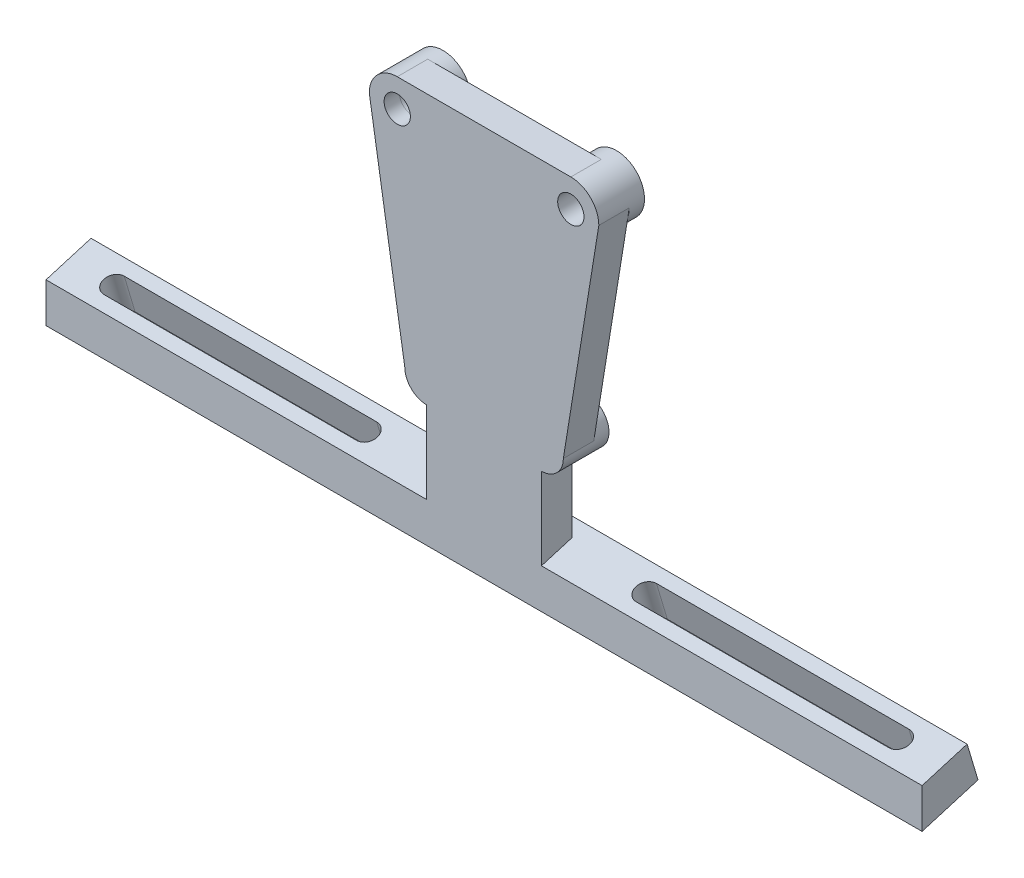
ISO-10303-21;
HEADER;
FILE_DESCRIPTION(('STEP AP214'),'2;1');
FILE_NAME('part.step','',(''),(''),'','','');
FILE_SCHEMA(('AUTOMOTIVE_DESIGN { 1 0 10303 214 1 1 1 1 }'));
ENDSEC;
DATA;
#1=APPLICATION_CONTEXT('core data for automotive mechanical design processes');
#2=APPLICATION_PROTOCOL_DEFINITION('international standard','automotive_design',2000,#1);
#3=PRODUCT_CONTEXT('',#1,'mechanical');
#4=PRODUCT('Part','Part','',(#3));
#5=PRODUCT_RELATED_PRODUCT_CATEGORY('part','',(#4));
#6=PRODUCT_DEFINITION_FORMATION('','',#4);
#7=PRODUCT_DEFINITION_CONTEXT('part definition',#1,'design');
#8=PRODUCT_DEFINITION('design','',#6,#7);
#9=PRODUCT_DEFINITION_SHAPE('','',#8);
#10=(LENGTH_UNIT() NAMED_UNIT(*) SI_UNIT(.MILLI.,.METRE.));
#11=(NAMED_UNIT(*) PLANE_ANGLE_UNIT() SI_UNIT($,.RADIAN.));
#12=(NAMED_UNIT(*) SI_UNIT($,.STERADIAN.) SOLID_ANGLE_UNIT());
#13=UNCERTAINTY_MEASURE_WITH_UNIT(LENGTH_MEASURE(1.E-05),#10,'distance_accuracy_value','');
#14=(GEOMETRIC_REPRESENTATION_CONTEXT(3) GLOBAL_UNCERTAINTY_ASSIGNED_CONTEXT((#13)) GLOBAL_UNIT_ASSIGNED_CONTEXT((#10,
#11,#12)) REPRESENTATION_CONTEXT('',''));
#15=CARTESIAN_POINT('',(0.,0.,0.));
#16=DIRECTION('',(0.,0.,1.));
#17=DIRECTION('',(1.,0.,0.));
#18=AXIS2_PLACEMENT_3D('',#15,#16,#17);
#19=CARTESIAN_POINT('',(0.,-15.7739928273081,-4.7016006462552));
#20=DIRECTION('',(0.,-0.958336393200723,-0.285642009282651));
#21=DIRECTION('',(0.,0.285642009282651,-0.958336393200723));
#22=AXIS2_PLACEMENT_3D('',#19,#20,#21);
#23=PLANE('',#22);
#24=DIRECTION('',(1.,0.,0.));
#25=VECTOR('',#24,1.);
#26=CARTESIAN_POINT('',(0.,-17.2862308384462,0.371997333589113));
#27=LINE('',#26,#25);
#28=CARTESIAN_POINT('',(5.54960519700685,-17.2862308384462,0.37199733358911));
#29=VERTEX_POINT('',#28);
#30=CARTESIAN_POINT('',(47.6779734114226,-17.2862308384462,0.371997333589114));
#31=VERTEX_POINT('',#30);
#32=EDGE_CURVE('E283',#29,#31,#27,.T.);
#33=ORIENTED_EDGE('',*,*,#32,.F.);
#34=CARTESIAN_POINT('',(5.54960519700687,-17.7861043546908,2.04908602169037));
#35=DIRECTION('',(0.,-0.958336393200723,-0.285642009282651));
#36=DIRECTION('',(0.,0.285642009282651,-0.958336393200723));
#37=AXIS2_PLACEMENT_3D('',#34,#35,#36);
#38=CIRCLE('',#37,1.75);
#39=CARTESIAN_POINT('',(5.54960519700686,-18.2859778709354,3.72617470979162));
#40=VERTEX_POINT('',#39);
#41=EDGE_CURVE('E271',#29,#40,#38,.F.);
#42=ORIENTED_EDGE('',*,*,#41,.T.);
#43=DIRECTION('',(-1.,0.,0.));
#44=VECTOR('',#43,1.);
#45=CARTESIAN_POINT('',(0.,-18.2859778709354,3.72617470979162));
#46=LINE('',#45,#44);
#47=CARTESIAN_POINT('',(47.6779734114226,-18.2859778709354,3.72617470979162));
#48=VERTEX_POINT('',#47);
#49=EDGE_CURVE('E274',#48,#40,#46,.T.);
#50=ORIENTED_EDGE('',*,*,#49,.F.);
#51=CARTESIAN_POINT('',(47.6779734114226,-17.7861043546908,2.04908602169037));
#52=DIRECTION('',(0.,-0.958336393200723,-0.285642009282651));
#53=DIRECTION('',(0.,0.285642009282651,-0.958336393200723));
#54=AXIS2_PLACEMENT_3D('',#51,#52,#53);
#55=CIRCLE('',#54,1.75);
#56=EDGE_CURVE('E280',#48,#31,#55,.F.);
#57=ORIENTED_EDGE('',*,*,#56,.T.);
#58=EDGE_LOOP('',(#33,#42,#50,#57));
#59=FACE_BOUND('',#58,.T.);
#60=DIRECTION('',(0.,-0.285642009282651,0.958336393200723));
#61=VECTOR('',#60,1.);
#62=CARTESIAN_POINT('',(55.2979734114226,-15.7739928273081,-4.70160064625521));
#63=LINE('',#62,#61);
#64=CARTESIAN_POINT('',(55.2979734114226,-16.6662659033874,-1.70800119767469));
#65=VERTEX_POINT('',#64);
#66=CARTESIAN_POINT('',(55.2979734114226,-19.4465725092372,7.61999999981606));
#67=VERTEX_POINT('',#66);
#68=EDGE_CURVE('E307',#65,#67,#63,.T.);
#69=ORIENTED_EDGE('',*,*,#68,.T.);
#70=DIRECTION('',(-1.,0.,0.));
#71=VECTOR('',#70,1.);
#72=CARTESIAN_POINT('',(0.,-19.4465725092372,7.61999999981606));
#73=LINE('',#72,#71);
#74=CARTESIAN_POINT('',(-90.8579734114216,-19.4465725092372,7.61999999981606));
#75=VERTEX_POINT('',#74);
#76=EDGE_CURVE('E301',#67,#75,#73,.T.);
#77=ORIENTED_EDGE('',*,*,#76,.T.);
#78=DIRECTION('',(0.,-0.285642009282651,0.958336393200723));
#79=VECTOR('',#78,1.);
#80=CARTESIAN_POINT('',(-90.8579734114216,-15.7739928273081,-4.70160064625522));
#81=LINE('',#80,#79);
#82=CARTESIAN_POINT('',(-90.8579734114216,-16.6662659033874,-1.70800119767466));
#83=VERTEX_POINT('',#82);
#84=EDGE_CURVE('E306',#83,#75,#81,.T.);
#85=ORIENTED_EDGE('',*,*,#84,.F.);
#86=DIRECTION('',(-1.,0.,0.));
#87=VECTOR('',#86,1.);
#88=CARTESIAN_POINT('',(55.2979734114226,-16.6662659033874,-1.70800119767469));
#89=LINE('',#88,#87);
#90=EDGE_CURVE('E291',#65,#83,#89,.T.);
#91=ORIENTED_EDGE('',*,*,#90,.F.);
#92=EDGE_LOOP('',(#69,#77,#85,#91));
#93=FACE_BOUND('',#92,.T.);
#94=CARTESIAN_POINT('',(-83.2379734114216,-17.7861043546908,2.04908602169037));
#95=DIRECTION('',(0.,-0.958336393200723,-0.285642009282651));
#96=DIRECTION('',(0.,0.285642009282651,-0.958336393200723));
#97=AXIS2_PLACEMENT_3D('',#94,#95,#96);
#98=CIRCLE('',#97,1.75);
#99=CARTESIAN_POINT('',(-83.2379734114217,-18.2859778709355,3.72617470979163));
#100=VERTEX_POINT('',#99);
#101=CARTESIAN_POINT('',(-83.2379734114217,-17.2862308384462,0.371997333589108));
#102=VERTEX_POINT('',#101);
#103=EDGE_CURVE('E270',#100,#102,#98,.T.);
#104=ORIENTED_EDGE('',*,*,#103,.F.);
#105=DIRECTION('',(1.,0.,0.));
#106=VECTOR('',#105,1.);
#107=CARTESIAN_POINT('',(0.,-18.2859778709354,3.72617470979162));
#108=LINE('',#107,#106);
#109=CARTESIAN_POINT('',(-41.1096051970059,-18.2859778709355,3.72617470979162));
#110=VERTEX_POINT('',#109);
#111=EDGE_CURVE('E262',#100,#110,#108,.T.);
#112=ORIENTED_EDGE('',*,*,#111,.T.);
#113=CARTESIAN_POINT('',(-41.1096051970059,-17.7861043546908,2.04908602169037));
#114=DIRECTION('',(0.,-0.958336393200723,-0.285642009282651));
#115=DIRECTION('',(0.,0.285642009282651,-0.958336393200723));
#116=AXIS2_PLACEMENT_3D('',#113,#114,#115);
#117=CIRCLE('',#116,1.75);
#118=CARTESIAN_POINT('',(-41.1096051970059,-17.2862308384462,0.371997333589109));
#119=VERTEX_POINT('',#118);
#120=EDGE_CURVE('E248',#119,#110,#117,.T.);
#121=ORIENTED_EDGE('',*,*,#120,.F.);
#122=DIRECTION('',(-1.,0.,0.));
#123=VECTOR('',#122,1.);
#124=CARTESIAN_POINT('',(0.,-17.2862308384462,0.371997333589113));
#125=LINE('',#124,#123);
#126=EDGE_CURVE('E256',#119,#102,#125,.T.);
#127=ORIENTED_EDGE('',*,*,#126,.T.);
#128=EDGE_LOOP('',(#104,#112,#121,#127));
#129=FACE_BOUND('',#128,.T.);
#130=ADVANCED_FACE('F95',(#59,#93,#129),#23,.T.);
#131=CARTESIAN_POINT('',(55.4406036116355,-1.51179232123105,-30.3210318045859));
#132=DIRECTION('',(0.,0.958336393200728,0.285642009282632));
#133=DIRECTION('',(0.,-0.285642009282632,0.958336393200728));
#134=AXIS2_PLACEMENT_3D('',#131,#132,#133);
#135=PLANE('',#134);
#136=DIRECTION('',(-1.,0.,0.));
#137=VECTOR('',#136,1.);
#138=CARTESIAN_POINT('',(55.4406036116355,-11.2007947422388,2.18582409234985));
#139=LINE('',#138,#137);
#140=CARTESIAN_POINT('',(47.6779734114226,-11.2007947422388,2.18582409234984));
#141=VERTEX_POINT('',#140);
#142=CARTESIAN_POINT('',(5.54960519700685,-11.2007947422388,2.18582409234985));
#143=VERTEX_POINT('',#142);
#144=EDGE_CURVE('E12',#141,#143,#139,.T.);
#145=ORIENTED_EDGE('',*,*,#144,.F.);
#146=CARTESIAN_POINT('',(47.6779734114226,-11.7006682584834,3.86291278045111));
#147=DIRECTION('',(0.,0.958336393200728,0.285642009282632));
#148=DIRECTION('',(0.,-0.285642009282632,0.958336393200728));
#149=AXIS2_PLACEMENT_3D('',#146,#147,#148);
#150=CIRCLE('',#149,1.75);
#151=CARTESIAN_POINT('',(47.6779734114226,-12.200541774728,5.54000146855237));
#152=VERTEX_POINT('',#151);
#153=EDGE_CURVE('E103',#141,#152,#150,.F.);
#154=ORIENTED_EDGE('',*,*,#153,.T.);
#155=DIRECTION('',(1.,0.,0.));
#156=VECTOR('',#155,1.);
#157=CARTESIAN_POINT('',(55.4406036116355,-12.200541774728,5.54000146855236));
#158=LINE('',#157,#156);
#159=CARTESIAN_POINT('',(5.54960519700686,-12.200541774728,5.54000146855238));
#160=VERTEX_POINT('',#159);
#161=EDGE_CURVE('E453',#160,#152,#158,.T.);
#162=ORIENTED_EDGE('',*,*,#161,.F.);
#163=CARTESIAN_POINT('',(5.54960519700687,-11.7006682584834,3.86291278045112));
#164=DIRECTION('',(0.,0.958336393200728,0.285642009282632));
#165=DIRECTION('',(0.,-0.285642009282632,0.958336393200728));
#166=AXIS2_PLACEMENT_3D('',#163,#164,#165);
#167=CIRCLE('',#166,1.75);
#168=EDGE_CURVE('E450',#160,#143,#167,.F.);
#169=ORIENTED_EDGE('',*,*,#168,.T.);
#170=EDGE_LOOP('',(#145,#154,#162,#169));
#171=FACE_BOUND('',#170,.T.);
#172=DIRECTION('',(0.,0.285642009282632,-0.958336393200728));
#173=VECTOR('',#172,1.);
#174=CARTESIAN_POINT('',(-8.20202658857738,-13.0202651650178,8.29019482857502));
#175=LINE('',#174,#173);
#176=CARTESIAN_POINT('',(-8.20202658857735,-12.8205067097867,7.61999999981606));
#177=VERTEX_POINT('',#176);
#178=CARTESIAN_POINT('',(-8.20202658857738,-11.306360510758,2.53999999981602));
#179=VERTEX_POINT('',#178);
#180=EDGE_CURVE('E321',#177,#179,#175,.T.);
#181=ORIENTED_EDGE('',*,*,#180,.F.);
#182=DIRECTION('',(1.,0.,0.));
#183=VECTOR('',#182,1.);
#184=CARTESIAN_POINT('',(55.4406036116355,-12.8205067097867,7.61999999981606));
#185=LINE('',#184,#183);
#186=CARTESIAN_POINT('',(55.2979734114226,-12.8205067097867,7.61999999981607));
#187=VERTEX_POINT('',#186);
#188=EDGE_CURVE('E297',#177,#187,#185,.T.);
#189=ORIENTED_EDGE('',*,*,#188,.T.);
#190=DIRECTION('',(0.,-0.285642009282632,0.958336393200728));
#191=VECTOR('',#190,1.);
#192=CARTESIAN_POINT('',(55.2979734114226,-9.68855673110167,-2.88777388749156));
#193=LINE('',#192,#191);
#194=CARTESIAN_POINT('',(55.2979734114226,-10.58082980718,0.105825561086174));
#195=VERTEX_POINT('',#194);
#196=EDGE_CURVE('E311',#195,#187,#193,.T.);
#197=ORIENTED_EDGE('',*,*,#196,.F.);
#198=DIRECTION('',(1.,0.,0.));
#199=VECTOR('',#198,1.);
#200=CARTESIAN_POINT('',(-90.8579734114217,-10.58082980718,0.105825561086214));
#201=LINE('',#200,#199);
#202=CARTESIAN_POINT('',(-90.8579734114217,-10.58082980718,0.105825561086214));
#203=VERTEX_POINT('',#202);
#204=EDGE_CURVE('E285',#203,#195,#201,.T.);
#205=ORIENTED_EDGE('',*,*,#204,.F.);
#206=DIRECTION('',(0.,-0.285642009282632,0.958336393200728));
#207=VECTOR('',#206,1.);
#208=CARTESIAN_POINT('',(-90.8579734114216,-9.68855673110161,-2.88777388749153));
#209=LINE('',#208,#207);
#210=CARTESIAN_POINT('',(-90.8579734114217,-12.8205067097867,7.61999999981606));
#211=VERTEX_POINT('',#210);
#212=EDGE_CURVE('E310',#203,#211,#209,.T.);
#213=ORIENTED_EDGE('',*,*,#212,.T.);
#214=CARTESIAN_POINT('',(-27.3579734114216,-12.8205067097867,7.61999999981606));
#215=VERTEX_POINT('',#214);
#216=EDGE_CURVE('E300',#211,#215,#185,.T.);
#217=ORIENTED_EDGE('',*,*,#216,.T.);
#218=DIRECTION('',(0.,-0.285642009282632,0.958336393200728));
#219=VECTOR('',#218,1.);
#220=CARTESIAN_POINT('',(-27.3579734114216,-14.4108701202642,12.9557107326426));
#221=LINE('',#220,#219);
#222=CARTESIAN_POINT('',(-27.3579734114216,-11.306360510758,2.53999999981603));
#223=VERTEX_POINT('',#222);
#224=EDGE_CURVE('E318',#223,#215,#221,.T.);
#225=ORIENTED_EDGE('',*,*,#224,.F.);
#226=DIRECTION('',(-1.,0.,0.));
#227=VECTOR('',#226,1.);
#228=CARTESIAN_POINT('',(-27.3579734114216,-11.3063605101407,2.54));
#229=LINE('',#228,#227);
#230=EDGE_CURVE('E325',#179,#223,#229,.T.);
#231=ORIENTED_EDGE('',*,*,#230,.F.);
#232=EDGE_LOOP('',(#181,#189,#197,#205,#213,#217,#225,#231));
#233=FACE_BOUND('',#232,.T.);
#234=CARTESIAN_POINT('',(-41.1096051970059,-11.7006682584834,3.86291278045112));
#235=DIRECTION('',(0.,0.958336393200728,0.285642009282632));
#236=DIRECTION('',(0.,-0.285642009282632,0.958336393200728));
#237=AXIS2_PLACEMENT_3D('',#234,#235,#236);
#238=CIRCLE('',#237,1.75);
#239=CARTESIAN_POINT('',(-41.1096051970059,-12.200541774728,5.54000146855239));
#240=VERTEX_POINT('',#239);
#241=CARTESIAN_POINT('',(-41.1096051970059,-11.2007947422388,2.18582409234986));
#242=VERTEX_POINT('',#241);
#243=EDGE_CURVE('E442',#240,#242,#238,.T.);
#244=ORIENTED_EDGE('',*,*,#243,.F.);
#245=DIRECTION('',(-1.,0.,0.));
#246=VECTOR('',#245,1.);
#247=CARTESIAN_POINT('',(55.4406036116355,-12.200541774728,5.54000146855236));
#248=LINE('',#247,#246);
#249=CARTESIAN_POINT('',(-83.2379734114217,-12.200541774728,5.5400014685524));
#250=VERTEX_POINT('',#249);
#251=EDGE_CURVE('E265',#240,#250,#248,.T.);
#252=ORIENTED_EDGE('',*,*,#251,.T.);
#253=CARTESIAN_POINT('',(-83.2379734114216,-11.7006682584834,3.86291278045113));
#254=DIRECTION('',(0.,0.958336393200728,0.285642009282632));
#255=DIRECTION('',(0.,-0.285642009282632,0.958336393200728));
#256=AXIS2_PLACEMENT_3D('',#253,#254,#255);
#257=CIRCLE('',#256,1.75);
#258=CARTESIAN_POINT('',(-83.2379734114217,-11.2007947422388,2.18582409234986));
#259=VERTEX_POINT('',#258);
#260=EDGE_CURVE('E447',#259,#250,#257,.T.);
#261=ORIENTED_EDGE('',*,*,#260,.F.);
#262=DIRECTION('',(1.,0.,0.));
#263=VECTOR('',#262,1.);
#264=CARTESIAN_POINT('',(55.4406036116355,-11.2007947422388,2.18582409234985));
#265=LINE('',#264,#263);
#266=EDGE_CURVE('E444',#259,#242,#265,.T.);
#267=ORIENTED_EDGE('',*,*,#266,.T.);
#268=EDGE_LOOP('',(#244,#252,#261,#267));
#269=FACE_BOUND('',#268,.T.);
#270=ADVANCED_FACE('F458',(#171,#233,#269),#135,.T.);
#271=CARTESIAN_POINT('',(-90.8579734114216,130.63687151607,38.9376619013926));
#272=DIRECTION('',(1.,0.,0.));
#273=DIRECTION('',(0.,1.,0.));
#274=AXIS2_PLACEMENT_3D('',#271,#272,#273);
#275=PLANE('',#274);
#276=DIRECTION('',(0.,-1.,0.));
#277=VECTOR('',#276,1.);
#278=CARTESIAN_POINT('',(-90.8579734114216,130.63687151607,7.61999999981607));
#279=LINE('',#278,#277);
#280=EDGE_CURVE('E304',#211,#75,#279,.T.);
#281=ORIENTED_EDGE('',*,*,#280,.F.);
#282=ORIENTED_EDGE('',*,*,#212,.F.);
#283=DIRECTION('',(0.,0.958336393200723,0.285642009282651));
#284=VECTOR('',#283,1.);
#285=CARTESIAN_POINT('',(-90.8579734114216,-16.6662659033874,-1.70800119767466));
#286=LINE('',#285,#284);
#287=EDGE_CURVE('E294',#83,#203,#286,.T.);
#288=ORIENTED_EDGE('',*,*,#287,.F.);
#289=ORIENTED_EDGE('',*,*,#84,.T.);
#290=EDGE_LOOP('',(#281,#282,#288,#289));
#291=FACE_BOUND('',#290,.T.);
#292=ADVANCED_FACE('F489',(#291),#275,.F.);
#293=CARTESIAN_POINT('',(55.2979734114226,130.63687151607,38.9376619013926));
#294=DIRECTION('',(1.,0.,0.));
#295=DIRECTION('',(0.,1.,0.));
#296=AXIS2_PLACEMENT_3D('',#293,#294,#295);
#297=PLANE('',#296);
#298=ORIENTED_EDGE('',*,*,#196,.T.);
#299=DIRECTION('',(0.,-1.,0.));
#300=VECTOR('',#299,1.);
#301=CARTESIAN_POINT('',(55.2979734114226,130.63687151607,7.61999999981607));
#302=LINE('',#301,#300);
#303=EDGE_CURVE('E437',#187,#67,#302,.T.);
#304=ORIENTED_EDGE('',*,*,#303,.T.);
#305=ORIENTED_EDGE('',*,*,#68,.F.);
#306=DIRECTION('',(0.,-0.958336393200723,-0.285642009282651));
#307=VECTOR('',#306,1.);
#308=CARTESIAN_POINT('',(55.2979734114226,-10.58082980718,0.105825561086174));
#309=LINE('',#308,#307);
#310=EDGE_CURVE('E288',#195,#65,#309,.T.);
#311=ORIENTED_EDGE('',*,*,#310,.F.);
#312=EDGE_LOOP('',(#298,#304,#305,#311));
#313=FACE_BOUND('',#312,.T.);
#314=ADVANCED_FACE('F495',(#313),#297,.T.);
#315=CARTESIAN_POINT('',(0.,0.,2.54));
#316=DIRECTION('',(0.,0.,1.));
#317=DIRECTION('',(1.,0.,0.));
#318=AXIS2_PLACEMENT_3D('',#315,#316,#317);
#319=PLANE('',#318);
#320=CARTESIAN_POINT('',(-8.20202658857738,4.50908410817874,2.54));
#321=DIRECTION('',(0.,0.,1.));
#322=DIRECTION('',(1.,0.,0.));
#323=AXIS2_PLACEMENT_3D('',#320,#321,#322);
#324=CIRCLE('',#323,3.64921330947254);
#325=CARTESIAN_POINT('',(-4.55281327910484,4.50908410817874,2.54));
#326=VERTEX_POINT('',#325);
#327=CARTESIAN_POINT('',(-8.20202658857738,0.859870798706196,2.54));
#328=VERTEX_POINT('',#327);
#329=EDGE_CURVE('E434',#326,#328,#324,.T.);
#330=ORIENTED_EDGE('',*,*,#329,.T.);
#331=DIRECTION('',(0.,1.,0.));
#332=VECTOR('',#331,1.);
#333=CARTESIAN_POINT('',(-8.20202658857738,-32.3123188305748,2.54));
#334=LINE('',#333,#332);
#335=EDGE_CURVE('E334',#179,#328,#334,.T.);
#336=ORIENTED_EDGE('',*,*,#335,.F.);
#337=ORIENTED_EDGE('',*,*,#230,.T.);
#338=DIRECTION('',(0.,1.,0.));
#339=VECTOR('',#338,1.);
#340=CARTESIAN_POINT('',(-27.3579734114216,-32.3123188305748,2.54));
#341=LINE('',#340,#339);
#342=CARTESIAN_POINT('',(-27.3579734114216,0.859870798706195,2.54));
#343=VERTEX_POINT('',#342);
#344=EDGE_CURVE('E329',#223,#343,#341,.T.);
#345=ORIENTED_EDGE('',*,*,#344,.T.);
#346=CARTESIAN_POINT('',(-27.3579734114216,4.50908410817874,2.54));
#347=DIRECTION('',(0.,0.,1.));
#348=DIRECTION('',(1.,0.,0.));
#349=AXIS2_PLACEMENT_3D('',#346,#347,#348);
#350=CIRCLE('',#349,3.64921330947255);
#351=CARTESIAN_POINT('',(-31.0071867208942,4.50908410817874,2.54));
#352=VERTEX_POINT('',#351);
#353=EDGE_CURVE('E367',#352,#343,#350,.F.);
#354=ORIENTED_EDGE('',*,*,#353,.F.);
#355=DIRECTION('',(-0.159492214781064,0.987199186296378,0.));
#356=VECTOR('',#355,1.);
#357=CARTESIAN_POINT('',(-29.5084752138368,-4.76739864861884,2.54));
#358=LINE('',#357,#356);
#359=CARTESIAN_POINT('',(-36.6894734882103,39.6803862353543,2.54));
#360=VERTEX_POINT('',#359);
#361=EDGE_CURVE('E404',#352,#360,#358,.T.);
#362=ORIENTED_EDGE('',*,*,#361,.T.);
#363=CARTESIAN_POINT('',(-32.2599999999995,41.1500000000004,2.54));
#364=DIRECTION('',(0.,0.,1.));
#365=DIRECTION('',(1.,0.,0.));
#366=AXIS2_PLACEMENT_3D('',#363,#364,#365);
#367=CIRCLE('',#366,4.66690475583118);
#368=CARTESIAN_POINT('',(-32.2599999999995,45.8169047558315,2.54));
#369=VERTEX_POINT('',#368);
#370=EDGE_CURVE('E377',#360,#369,#367,.T.);
#371=ORIENTED_EDGE('',*,*,#370,.T.);
#372=DIRECTION('',(-1.,0.,0.));
#373=VECTOR('',#372,1.);
#374=CARTESIAN_POINT('',(4.83025559691642E-13,45.8169047558312,2.54));
#375=LINE('',#374,#373);
#376=CARTESIAN_POINT('',(-3.29999999999946,45.8169047558312,2.54));
#377=VERTEX_POINT('',#376);
#378=EDGE_CURVE('E399',#377,#369,#375,.T.);
#379=ORIENTED_EDGE('',*,*,#378,.F.);
#380=CARTESIAN_POINT('',(-3.2999999999995,41.15,2.54));
#381=DIRECTION('',(0.,0.,1.));
#382=DIRECTION('',(1.,0.,0.));
#383=AXIS2_PLACEMENT_3D('',#380,#381,#382);
#384=CIRCLE('',#383,4.66690475583118);
#385=CARTESIAN_POINT('',(1.12947348821131,39.680386235354,2.54));
#386=VERTEX_POINT('',#385);
#387=EDGE_CURVE('E387',#377,#386,#384,.T.);
#388=ORIENTED_EDGE('',*,*,#387,.T.);
#389=DIRECTION('',(0.159492214781066,0.987199186296378,0.));
#390=VECTOR('',#389,1.);
#391=CARTESIAN_POINT('',(-5.14695780672783,0.831544141622972,2.54));
#392=LINE('',#391,#390);
#393=EDGE_CURVE('E396',#326,#386,#392,.T.);
#394=ORIENTED_EDGE('',*,*,#393,.F.);
#395=EDGE_LOOP('',(#330,#336,#337,#345,#354,#362,#371,#379,#388,#394));
#396=FACE_BOUND('',#395,.T.);
#397=ADVANCED_FACE('F549',(#396),#319,.F.);
#398=CARTESIAN_POINT('',(-8.20202658857738,4.50908410817874,2.54));
#399=DIRECTION('',(0.,0.,-1.));
#400=DIRECTION('',(-1.,0.,0.));
#401=AXIS2_PLACEMENT_3D('',#398,#399,#400);
#402=CYLINDRICAL_SURFACE('',#401,3.64921330947254);
#403=ORIENTED_EDGE('',*,*,#329,.F.);
#404=DIRECTION('',(0.,0.,-1.));
#405=VECTOR('',#404,1.);
#406=CARTESIAN_POINT('',(-4.55281327910484,4.50908410817874,5.08));
#407=LINE('',#406,#405);
#408=CARTESIAN_POINT('',(-4.55281327910484,4.50908410817874,7.62));
#409=VERTEX_POINT('',#408);
#410=EDGE_CURVE('E410',#409,#326,#407,.T.);
#411=ORIENTED_EDGE('',*,*,#410,.F.);
#412=CARTESIAN_POINT('',(-8.20202658857738,4.50908410817874,7.62));
#413=DIRECTION('',(0.,0.,1.));
#414=DIRECTION('',(1.,0.,0.));
#415=AXIS2_PLACEMENT_3D('',#412,#413,#414);
#416=CIRCLE('',#415,3.64921330947254);
#417=CARTESIAN_POINT('',(-8.20202658857738,0.859870798706196,7.62));
#418=VERTEX_POINT('',#417);
#419=EDGE_CURVE('E345',#418,#409,#416,.T.);
#420=ORIENTED_EDGE('',*,*,#419,.F.);
#421=DIRECTION('',(0.,0.,-1.));
#422=VECTOR('',#421,1.);
#423=CARTESIAN_POINT('',(-8.20202658857738,0.859870798706196,5.08));
#424=LINE('',#423,#422);
#425=EDGE_CURVE('E413',#418,#328,#424,.T.);
#426=ORIENTED_EDGE('',*,*,#425,.T.);
#427=EDGE_LOOP('',(#403,#411,#420,#426));
#428=FACE_BOUND('',#427,.T.);
#429=CARTESIAN_POINT('',(-8.20202658857738,4.50908410817874,0.));
#430=DIRECTION('',(0.,0.,1.));
#431=DIRECTION('',(1.,0.,0.));
#432=AXIS2_PLACEMENT_3D('',#429,#430,#431);
#433=CIRCLE('',#432,3.64921330947254);
#434=CARTESIAN_POINT('',(-4.55281327910484,4.50908410817874,0.));
#435=VERTEX_POINT('',#434);
#436=EDGE_CURVE('E433',#435,#435,#433,.T.);
#437=ORIENTED_EDGE('',*,*,#436,.T.);
#438=EDGE_LOOP('',(#437));
#439=FACE_BOUND('',#438,.T.);
#440=ADVANCED_FACE('F97',(#428,#439),#402,.T.);
#441=CARTESIAN_POINT('',(0.,0.,0.));
#442=DIRECTION('',(0.,0.,1.));
#443=DIRECTION('',(1.,0.,0.));
#444=AXIS2_PLACEMENT_3D('',#441,#442,#443);
#445=PLANE('',#444);
#446=ORIENTED_EDGE('',*,*,#436,.F.);
#447=EDGE_LOOP('',(#446));
#448=FACE_BOUND('',#447,.T.);
#449=ADVANCED_FACE('F557',(#448),#445,.F.);
#450=CARTESIAN_POINT('',(-3.2999999999995,41.15,5.08));
#451=DIRECTION('',(0.,0.,-1.));
#452=DIRECTION('',(-1.,0.,0.));
#453=AXIS2_PLACEMENT_3D('',#450,#451,#452);
#454=CYLINDRICAL_SURFACE('',#453,2.19365251256904);
#455=CARTESIAN_POINT('',(-3.2999999999995,41.15,0.));
#456=DIRECTION('',(0.,0.,1.));
#457=DIRECTION('',(1.,0.,0.));
#458=AXIS2_PLACEMENT_3D('',#455,#456,#457);
#459=CIRCLE('',#458,2.19365251256904);
#460=CARTESIAN_POINT('',(-1.10634748743047,41.15,0.));
#461=VERTEX_POINT('',#460);
#462=EDGE_CURVE('E389',#461,#461,#459,.T.);
#463=ORIENTED_EDGE('',*,*,#462,.F.);
#464=EDGE_LOOP('',(#463));
#465=FACE_BOUND('',#464,.T.);
#466=CARTESIAN_POINT('',(-3.2999999999995,41.15,7.62));
#467=DIRECTION('',(0.,0.,1.));
#468=DIRECTION('',(1.,0.,0.));
#469=AXIS2_PLACEMENT_3D('',#466,#467,#468);
#470=CIRCLE('',#469,2.19365251256904);
#471=CARTESIAN_POINT('',(-1.10634748743047,41.15,7.62));
#472=VERTEX_POINT('',#471);
#473=EDGE_CURVE('E340',#472,#472,#470,.T.);
#474=ORIENTED_EDGE('',*,*,#473,.T.);
#475=EDGE_LOOP('',(#474));
#476=FACE_BOUND('',#475,.T.);
#477=ADVANCED_FACE('F553',(#465,#476),#454,.F.);
#478=CARTESIAN_POINT('',(-32.2599999999995,41.1500000000004,5.08));
#479=DIRECTION('',(0.,0.,-1.));
#480=DIRECTION('',(-1.,0.,0.));
#481=AXIS2_PLACEMENT_3D('',#478,#479,#480);
#482=CYLINDRICAL_SURFACE('',#481,2.22119728766713);
#483=CARTESIAN_POINT('',(-32.2599999999995,41.1500000000004,5.08));
#484=DIRECTION('',(0.,0.,1.));
#485=DIRECTION('',(1.,0.,0.));
#486=AXIS2_PLACEMENT_3D('',#483,#484,#485);
#487=CIRCLE('',#486,2.22119728766713);
#488=CARTESIAN_POINT('',(-30.0388027123324,41.1500000000004,5.08));
#489=VERTEX_POINT('',#488);
#490=EDGE_CURVE('E366',#489,#489,#487,.T.);
#491=ORIENTED_EDGE('',*,*,#490,.T.);
#492=EDGE_LOOP('',(#491));
#493=FACE_BOUND('',#492,.T.);
#494=CARTESIAN_POINT('',(-32.2599999999995,41.1500000000004,2.54));
#495=DIRECTION('',(0.,0.,1.));
#496=DIRECTION('',(1.,0.,0.));
#497=AXIS2_PLACEMENT_3D('',#494,#495,#496);
#498=CIRCLE('',#497,2.22119728766713);
#499=CARTESIAN_POINT('',(-30.0388027123324,41.1500000000004,2.54));
#500=VERTEX_POINT('',#499);
#501=EDGE_CURVE('E407',#500,#500,#498,.T.);
#502=ORIENTED_EDGE('',*,*,#501,.F.);
#503=EDGE_LOOP('',(#502));
#504=FACE_BOUND('',#503,.T.);
#505=ADVANCED_FACE('F556',(#493,#504),#482,.F.);
#506=CARTESIAN_POINT('',(-3.2999999999995,41.15,5.08));
#507=DIRECTION('',(0.,0.,-1.));
#508=DIRECTION('',(-1.,0.,0.));
#509=AXIS2_PLACEMENT_3D('',#506,#507,#508);
#510=CYLINDRICAL_SURFACE('',#509,4.66690475583118);
#511=DIRECTION('',(0.,0.,-1.));
#512=VECTOR('',#511,1.);
#513=CARTESIAN_POINT('',(1.36690475583168,41.15,5.08));
#514=LINE('',#513,#512);
#515=CARTESIAN_POINT('',(1.36690475583168,41.15,7.62));
#516=VERTEX_POINT('',#515);
#517=CARTESIAN_POINT('',(1.36690475583168,41.15,2.54));
#518=VERTEX_POINT('',#517);
#519=EDGE_CURVE('E430',#516,#518,#514,.T.);
#520=ORIENTED_EDGE('',*,*,#519,.T.);
#521=EDGE_CURVE('E385',#386,#518,#384,.T.);
#522=ORIENTED_EDGE('',*,*,#521,.F.);
#523=ORIENTED_EDGE('',*,*,#387,.F.);
#524=DIRECTION('',(0.,0.,-1.));
#525=VECTOR('',#524,1.);
#526=CARTESIAN_POINT('',(-3.2999999999995,45.8169047558312,5.08));
#527=LINE('',#526,#525);
#528=CARTESIAN_POINT('',(-3.2999999999995,45.8169047558312,7.62));
#529=VERTEX_POINT('',#528);
#530=EDGE_CURVE('E427',#529,#377,#527,.T.);
#531=ORIENTED_EDGE('',*,*,#530,.F.);
#532=CARTESIAN_POINT('',(-3.2999999999995,41.15,7.62));
#533=DIRECTION('',(0.,0.,1.));
#534=DIRECTION('',(1.,0.,0.));
#535=AXIS2_PLACEMENT_3D('',#532,#533,#534);
#536=CIRCLE('',#535,4.66690475583118);
#537=EDGE_CURVE('E351',#516,#529,#536,.T.);
#538=ORIENTED_EDGE('',*,*,#537,.F.);
#539=EDGE_LOOP('',(#520,#522,#523,#531,#538));
#540=FACE_BOUND('',#539,.T.);
#541=CARTESIAN_POINT('',(-3.2999999999995,41.15,0.));
#542=DIRECTION('',(0.,0.,1.));
#543=DIRECTION('',(1.,0.,0.));
#544=AXIS2_PLACEMENT_3D('',#541,#542,#543);
#545=CIRCLE('',#544,4.66690475583118);
#546=CARTESIAN_POINT('',(1.36690475583168,41.15,0.));
#547=VERTEX_POINT('',#546);
#548=EDGE_CURVE('E388',#547,#547,#545,.T.);
#549=ORIENTED_EDGE('',*,*,#548,.T.);
#550=EDGE_LOOP('',(#549));
#551=FACE_BOUND('',#550,.T.);
#552=ADVANCED_FACE('F561',(#540,#551),#510,.T.);
#553=CARTESIAN_POINT('',(4.83025559691642E-13,45.8169047558312,5.08));
#554=DIRECTION('',(0.,-1.,0.));
#555=DIRECTION('',(1.,0.,0.));
#556=AXIS2_PLACEMENT_3D('',#553,#554,#555);
#557=PLANE('',#556);
#558=ORIENTED_EDGE('',*,*,#378,.T.);
#559=DIRECTION('',(0.,0.,-1.));
#560=VECTOR('',#559,1.);
#561=CARTESIAN_POINT('',(-32.2599999999995,45.8169047558315,5.08));
#562=LINE('',#561,#560);
#563=CARTESIAN_POINT('',(-32.2599999999995,45.8169047558315,7.62));
#564=VERTEX_POINT('',#563);
#565=EDGE_CURVE('E424',#564,#369,#562,.T.);
#566=ORIENTED_EDGE('',*,*,#565,.F.);
#567=DIRECTION('',(-1.,0.,0.));
#568=VECTOR('',#567,1.);
#569=CARTESIAN_POINT('',(-3.2999999999995,45.8169047558312,7.62));
#570=LINE('',#569,#568);
#571=EDGE_CURVE('E354',#529,#564,#570,.T.);
#572=ORIENTED_EDGE('',*,*,#571,.F.);
#573=ORIENTED_EDGE('',*,*,#530,.T.);
#574=EDGE_LOOP('',(#558,#566,#572,#573));
#575=FACE_BOUND('',#574,.T.);
#576=ADVANCED_FACE('F574',(#575),#557,.F.);
#577=CARTESIAN_POINT('',(-32.2599999999995,41.1500000000004,5.08));
#578=DIRECTION('',(0.,0.,-1.));
#579=DIRECTION('',(-1.,0.,0.));
#580=AXIS2_PLACEMENT_3D('',#577,#578,#579);
#581=CYLINDRICAL_SURFACE('',#580,4.66690475583118);
#582=ORIENTED_EDGE('',*,*,#565,.T.);
#583=ORIENTED_EDGE('',*,*,#370,.F.);
#584=CARTESIAN_POINT('',(-36.9269047558307,41.1500000000003,2.54));
#585=VERTEX_POINT('',#584);
#586=EDGE_CURVE('E380',#585,#360,#367,.T.);
#587=ORIENTED_EDGE('',*,*,#586,.F.);
#588=DIRECTION('',(0.,0.,-1.));
#589=VECTOR('',#588,1.);
#590=CARTESIAN_POINT('',(-36.9269047558307,41.1500000000004,5.08));
#591=LINE('',#590,#589);
#592=CARTESIAN_POINT('',(-36.9269047558307,41.1500000000004,7.62));
#593=VERTEX_POINT('',#592);
#594=EDGE_CURVE('E422',#593,#585,#591,.T.);
#595=ORIENTED_EDGE('',*,*,#594,.F.);
#596=CARTESIAN_POINT('',(-32.2599999999995,41.1500000000004,7.62));
#597=DIRECTION('',(0.,0.,1.));
#598=DIRECTION('',(1.,0.,0.));
#599=AXIS2_PLACEMENT_3D('',#596,#597,#598);
#600=CIRCLE('',#599,4.66690475583118);
#601=EDGE_CURVE('E357',#564,#593,#600,.T.);
#602=ORIENTED_EDGE('',*,*,#601,.F.);
#603=EDGE_LOOP('',(#582,#583,#587,#595,#602));
#604=FACE_BOUND('',#603,.T.);
#605=CARTESIAN_POINT('',(-32.2599999999995,41.1500000000004,0.));
#606=DIRECTION('',(0.,0.,1.));
#607=DIRECTION('',(1.,0.,0.));
#608=AXIS2_PLACEMENT_3D('',#605,#606,#607);
#609=CIRCLE('',#608,4.66690475583118);
#610=CARTESIAN_POINT('',(-27.5930952441683,41.1500000000004,0.));
#611=VERTEX_POINT('',#610);
#612=EDGE_CURVE('E378',#611,#611,#609,.T.);
#613=ORIENTED_EDGE('',*,*,#612,.T.);
#614=EDGE_LOOP('',(#613));
#615=FACE_BOUND('',#614,.T.);
#616=ADVANCED_FACE('F570',(#604,#615),#581,.T.);
#617=CARTESIAN_POINT('',(-29.5084752138368,-4.76739864861884,5.08));
#618=DIRECTION('',(-0.987199186296378,-0.159492214781064,0.));
#619=DIRECTION('',(0.159492214781064,-0.987199186296378,0.));
#620=AXIS2_PLACEMENT_3D('',#617,#618,#619);
#621=PLANE('',#620);
#622=ORIENTED_EDGE('',*,*,#361,.F.);
#623=DIRECTION('',(0.,0.,-1.));
#624=VECTOR('',#623,1.);
#625=CARTESIAN_POINT('',(-31.0071867208942,4.50908410817874,5.08));
#626=LINE('',#625,#624);
#627=CARTESIAN_POINT('',(-31.0071867208942,4.50908410817874,7.62));
#628=VERTEX_POINT('',#627);
#629=EDGE_CURVE('E419',#628,#352,#626,.T.);
#630=ORIENTED_EDGE('',*,*,#629,.F.);
#631=DIRECTION('',(0.159492214781064,-0.987199186296378,0.));
#632=VECTOR('',#631,1.);
#633=CARTESIAN_POINT('',(-36.9269047558307,41.1500000000004,7.62));
#634=LINE('',#633,#632);
#635=EDGE_CURVE('E360',#593,#628,#634,.T.);
#636=ORIENTED_EDGE('',*,*,#635,.F.);
#637=ORIENTED_EDGE('',*,*,#594,.T.);
#638=EDGE_CURVE('E403',#360,#585,#358,.T.);
#639=ORIENTED_EDGE('',*,*,#638,.F.);
#640=EDGE_LOOP('',(#622,#630,#636,#637,#639));
#641=FACE_BOUND('',#640,.T.);
#642=ADVANCED_FACE('F566',(#641),#621,.T.);
#643=CARTESIAN_POINT('',(-27.3579734114216,4.50908410817874,5.08));
#644=DIRECTION('',(0.,0.,-1.));
#645=DIRECTION('',(-1.,0.,0.));
#646=AXIS2_PLACEMENT_3D('',#643,#644,#645);
#647=CYLINDRICAL_SURFACE('',#646,3.64921330947255);
#648=ORIENTED_EDGE('',*,*,#629,.T.);
#649=ORIENTED_EDGE('',*,*,#353,.T.);
#650=DIRECTION('',(0.,0.,-1.));
#651=VECTOR('',#650,1.);
#652=CARTESIAN_POINT('',(-27.3579734114216,0.859870798706195,5.08));
#653=LINE('',#652,#651);
#654=CARTESIAN_POINT('',(-27.3579734114216,0.859870798706195,7.62));
#655=VERTEX_POINT('',#654);
#656=EDGE_CURVE('E416',#655,#343,#653,.T.);
#657=ORIENTED_EDGE('',*,*,#656,.F.);
#658=CARTESIAN_POINT('',(-27.3579734114216,4.50908410817874,7.62));
#659=DIRECTION('',(0.,0.,1.));
#660=DIRECTION('',(1.,0.,0.));
#661=AXIS2_PLACEMENT_3D('',#658,#659,#660);
#662=CIRCLE('',#661,3.64921330947255);
#663=EDGE_CURVE('E363',#628,#655,#662,.T.);
#664=ORIENTED_EDGE('',*,*,#663,.F.);
#665=EDGE_LOOP('',(#648,#649,#657,#664));
#666=FACE_BOUND('',#665,.T.);
#667=CARTESIAN_POINT('',(-27.3579734114216,4.50908410817874,0.));
#668=DIRECTION('',(0.,0.,1.));
#669=DIRECTION('',(1.,0.,0.));
#670=AXIS2_PLACEMENT_3D('',#667,#668,#669);
#671=CIRCLE('',#670,3.64921330947255);
#672=CARTESIAN_POINT('',(-23.7087601019491,4.50908410817874,0.));
#673=VERTEX_POINT('',#672);
#674=EDGE_CURVE('E371',#673,#673,#671,.F.);
#675=ORIENTED_EDGE('',*,*,#674,.F.);
#676=EDGE_LOOP('',(#675));
#677=FACE_BOUND('',#676,.T.);
#678=ADVANCED_FACE('F563',(#666,#677),#647,.T.);
#679=CARTESIAN_POINT('',(-5.14695780672783,0.831544141622972,5.08));
#680=DIRECTION('',(-0.987199186296378,0.159492214781066,0.));
#681=DIRECTION('',(-0.159492214781066,-0.987199186296378,0.));
#682=AXIS2_PLACEMENT_3D('',#679,#680,#681);
#683=PLANE('',#682);
#684=ORIENTED_EDGE('',*,*,#393,.T.);
#685=EDGE_CURVE('E400',#386,#518,#392,.T.);
#686=ORIENTED_EDGE('',*,*,#685,.T.);
#687=ORIENTED_EDGE('',*,*,#519,.F.);
#688=DIRECTION('',(0.159492214781066,0.987199186296378,0.));
#689=VECTOR('',#688,1.);
#690=CARTESIAN_POINT('',(-4.55281327910484,4.50908410817874,7.62));
#691=LINE('',#690,#689);
#692=EDGE_CURVE('E348',#409,#516,#691,.T.);
#693=ORIENTED_EDGE('',*,*,#692,.F.);
#694=ORIENTED_EDGE('',*,*,#410,.T.);
#695=EDGE_LOOP('',(#684,#686,#687,#693,#694));
#696=FACE_BOUND('',#695,.T.);
#697=ADVANCED_FACE('F544',(#696),#683,.F.);
#698=CARTESIAN_POINT('',(0.,0.,2.54));
#699=DIRECTION('',(0.,0.,1.));
#700=DIRECTION('',(1.,0.,0.));
#701=AXIS2_PLACEMENT_3D('',#698,#699,#700);
#702=PLANE('',#701);
#703=ORIENTED_EDGE('',*,*,#685,.F.);
#704=ORIENTED_EDGE('',*,*,#521,.T.);
#705=EDGE_LOOP('',(#703,#704));
#706=FACE_BOUND('',#705,.T.);
#707=ADVANCED_FACE('F540',(#706),#702,.T.);
#708=CARTESIAN_POINT('',(0.,0.,0.));
#709=DIRECTION('',(0.,0.,1.));
#710=DIRECTION('',(1.,0.,0.));
#711=AXIS2_PLACEMENT_3D('',#708,#709,#710);
#712=PLANE('',#711);
#713=ORIENTED_EDGE('',*,*,#462,.T.);
#714=EDGE_LOOP('',(#713));
#715=FACE_BOUND('',#714,.T.);
#716=ORIENTED_EDGE('',*,*,#548,.F.);
#717=EDGE_LOOP('',(#716));
#718=FACE_BOUND('',#717,.T.);
#719=ADVANCED_FACE('F543',(#715,#718),#712,.F.);
#720=CARTESIAN_POINT('',(0.,0.,2.54));
#721=DIRECTION('',(0.,0.,1.));
#722=DIRECTION('',(1.,0.,0.));
#723=AXIS2_PLACEMENT_3D('',#720,#721,#722);
#724=PLANE('',#723);
#725=ORIENTED_EDGE('',*,*,#501,.T.);
#726=EDGE_LOOP('',(#725));
#727=FACE_BOUND('',#726,.T.);
#728=CARTESIAN_POINT('',(-32.2599999999995,41.1500000000004,2.54));
#729=DIRECTION('',(0.,0.,1.));
#730=DIRECTION('',(1.,0.,0.));
#731=AXIS2_PLACEMENT_3D('',#728,#729,#730);
#732=CIRCLE('',#731,2.19365251256904);
#733=CARTESIAN_POINT('',(-30.0663474874305,41.1500000000004,2.54));
#734=VERTEX_POINT('',#733);
#735=EDGE_CURVE('E374',#734,#734,#732,.T.);
#736=ORIENTED_EDGE('',*,*,#735,.F.);
#737=EDGE_LOOP('',(#736));
#738=FACE_BOUND('',#737,.T.);
#739=ADVANCED_FACE('F533',(#727,#738),#724,.T.);
#740=CARTESIAN_POINT('',(-32.2599999999995,41.1500000000004,2.54));
#741=DIRECTION('',(0.,0.,-1.));
#742=DIRECTION('',(-1.,0.,0.));
#743=AXIS2_PLACEMENT_3D('',#740,#741,#742);
#744=CYLINDRICAL_SURFACE('',#743,2.19365251256904);
#745=ORIENTED_EDGE('',*,*,#735,.T.);
#746=EDGE_LOOP('',(#745));
#747=FACE_BOUND('',#746,.T.);
#748=CARTESIAN_POINT('',(-32.2599999999995,41.1500000000004,0.));
#749=DIRECTION('',(0.,0.,1.));
#750=DIRECTION('',(1.,0.,0.));
#751=AXIS2_PLACEMENT_3D('',#748,#749,#750);
#752=CIRCLE('',#751,2.19365251256904);
#753=CARTESIAN_POINT('',(-30.0663474874305,41.1500000000004,0.));
#754=VERTEX_POINT('',#753);
#755=EDGE_CURVE('E370',#754,#754,#752,.T.);
#756=ORIENTED_EDGE('',*,*,#755,.F.);
#757=EDGE_LOOP('',(#756));
#758=FACE_BOUND('',#757,.T.);
#759=ADVANCED_FACE('F531',(#747,#758),#744,.F.);
#760=ORIENTED_EDGE('',*,*,#586,.T.);
#761=ORIENTED_EDGE('',*,*,#638,.T.);
#762=EDGE_LOOP('',(#760,#761));
#763=FACE_BOUND('',#762,.T.);
#764=ADVANCED_FACE('F528',(#763),#724,.T.);
#765=CARTESIAN_POINT('',(0.,0.,0.));
#766=DIRECTION('',(0.,0.,1.));
#767=DIRECTION('',(1.,0.,0.));
#768=AXIS2_PLACEMENT_3D('',#765,#766,#767);
#769=PLANE('',#768);
#770=ORIENTED_EDGE('',*,*,#755,.T.);
#771=EDGE_LOOP('',(#770));
#772=FACE_BOUND('',#771,.T.);
#773=ORIENTED_EDGE('',*,*,#612,.F.);
#774=EDGE_LOOP('',(#773));
#775=FACE_BOUND('',#774,.T.);
#776=ADVANCED_FACE('F526',(#772,#775),#769,.F.);
#777=CARTESIAN_POINT('',(0.,0.,0.));
#778=DIRECTION('',(0.,0.,1.));
#779=DIRECTION('',(1.,0.,0.));
#780=AXIS2_PLACEMENT_3D('',#777,#778,#779);
#781=PLANE('',#780);
#782=ORIENTED_EDGE('',*,*,#674,.T.);
#783=EDGE_LOOP('',(#782));
#784=FACE_BOUND('',#783,.T.);
#785=ADVANCED_FACE('F522',(#784),#781,.F.);
#786=CARTESIAN_POINT('',(-8.20202658857738,4.50908410817874,5.08));
#787=DIRECTION('',(0.,0.,1.));
#788=DIRECTION('',(1.,0.,0.));
#789=AXIS2_PLACEMENT_3D('',#786,#787,#788);
#790=PLANE('',#789);
#791=CARTESIAN_POINT('',(-32.2599999999995,41.1500000000004,5.08));
#792=DIRECTION('',(0.,0.,1.));
#793=DIRECTION('',(1.,0.,0.));
#794=AXIS2_PLACEMENT_3D('',#791,#792,#793);
#795=CIRCLE('',#794,2.19365251256904);
#796=CARTESIAN_POINT('',(-30.0663474874305,41.1500000000004,5.08));
#797=VERTEX_POINT('',#796);
#798=EDGE_CURVE('E328',#797,#797,#795,.T.);
#799=ORIENTED_EDGE('',*,*,#798,.T.);
#800=EDGE_LOOP('',(#799));
#801=FACE_BOUND('',#800,.T.);
#802=ORIENTED_EDGE('',*,*,#490,.F.);
#803=EDGE_LOOP('',(#802));
#804=FACE_BOUND('',#803,.T.);
#805=ADVANCED_FACE('F518',(#801,#804),#790,.F.);
#806=CARTESIAN_POINT('',(-8.20202658857738,4.50908410817874,7.62));
#807=DIRECTION('',(0.,0.,1.));
#808=DIRECTION('',(1.,0.,0.));
#809=AXIS2_PLACEMENT_3D('',#806,#807,#808);
#810=PLANE('',#809);
#811=ORIENTED_EDGE('',*,*,#473,.F.);
#812=EDGE_LOOP('',(#811));
#813=FACE_BOUND('',#812,.T.);
#814=ORIENTED_EDGE('',*,*,#419,.T.);
#815=ORIENTED_EDGE('',*,*,#692,.T.);
#816=ORIENTED_EDGE('',*,*,#537,.T.);
#817=ORIENTED_EDGE('',*,*,#571,.T.);
#818=ORIENTED_EDGE('',*,*,#601,.T.);
#819=ORIENTED_EDGE('',*,*,#635,.T.);
#820=ORIENTED_EDGE('',*,*,#663,.T.);
#821=DIRECTION('',(0.,1.,0.));
#822=VECTOR('',#821,1.);
#823=CARTESIAN_POINT('',(-27.3579734114216,-32.3123188305748,7.62));
#824=LINE('',#823,#822);
#825=EDGE_CURVE('E324',#215,#655,#824,.T.);
#826=ORIENTED_EDGE('',*,*,#825,.F.);
#827=ORIENTED_EDGE('',*,*,#216,.F.);
#828=ORIENTED_EDGE('',*,*,#280,.T.);
#829=ORIENTED_EDGE('',*,*,#76,.F.);
#830=ORIENTED_EDGE('',*,*,#303,.F.);
#831=ORIENTED_EDGE('',*,*,#188,.F.);
#832=DIRECTION('',(0.,1.,0.));
#833=VECTOR('',#832,1.);
#834=CARTESIAN_POINT('',(-8.20202658857738,-32.3123188305748,7.62));
#835=LINE('',#834,#833);
#836=EDGE_CURVE('E331',#177,#418,#835,.T.);
#837=ORIENTED_EDGE('',*,*,#836,.T.);
#838=EDGE_LOOP('',(#814,#815,#816,#817,#818,#819,#820,#826,#827,#828,#829,#830,#831,#837));
#839=FACE_BOUND('',#838,.T.);
#840=CARTESIAN_POINT('',(-32.2599999999995,41.1500000000004,7.62));
#841=DIRECTION('',(0.,0.,1.));
#842=DIRECTION('',(1.,0.,0.));
#843=AXIS2_PLACEMENT_3D('',#840,#841,#842);
#844=CIRCLE('',#843,2.19365251256904);
#845=CARTESIAN_POINT('',(-30.0663474874305,41.1500000000004,7.62));
#846=VERTEX_POINT('',#845);
#847=EDGE_CURVE('E337',#846,#846,#844,.T.);
#848=ORIENTED_EDGE('',*,*,#847,.F.);
#849=EDGE_LOOP('',(#848));
#850=FACE_BOUND('',#849,.T.);
#851=ADVANCED_FACE('F514',(#813,#839,#850),#810,.T.);
#852=CARTESIAN_POINT('',(-32.2599999999995,41.1500000000004,7.62));
#853=DIRECTION('',(0.,0.,-1.));
#854=DIRECTION('',(-1.,0.,0.));
#855=AXIS2_PLACEMENT_3D('',#852,#853,#854);
#856=CYLINDRICAL_SURFACE('',#855,2.19365251256904);
#857=ORIENTED_EDGE('',*,*,#847,.T.);
#858=EDGE_LOOP('',(#857));
#859=FACE_BOUND('',#858,.T.);
#860=ORIENTED_EDGE('',*,*,#798,.F.);
#861=EDGE_LOOP('',(#860));
#862=FACE_BOUND('',#861,.T.);
#863=ADVANCED_FACE('F506',(#859,#862),#856,.F.);
#864=CARTESIAN_POINT('',(-8.20202658857738,-32.3123188305748,2.54));
#865=DIRECTION('',(-1.,0.,0.));
#866=DIRECTION('',(0.,-1.,0.));
#867=AXIS2_PLACEMENT_3D('',#864,#865,#866);
#868=PLANE('',#867);
#869=ORIENTED_EDGE('',*,*,#836,.F.);
#870=ORIENTED_EDGE('',*,*,#180,.T.);
#871=ORIENTED_EDGE('',*,*,#335,.T.);
#872=ORIENTED_EDGE('',*,*,#425,.F.);
#873=EDGE_LOOP('',(#869,#870,#871,#872));
#874=FACE_BOUND('',#873,.T.);
#875=ADVANCED_FACE('F502',(#874),#868,.F.);
#876=CARTESIAN_POINT('',(-27.3579734114216,-32.3123188305748,7.62));
#877=DIRECTION('',(1.,0.,0.));
#878=DIRECTION('',(0.,1.,0.));
#879=AXIS2_PLACEMENT_3D('',#876,#877,#878);
#880=PLANE('',#879);
#881=ORIENTED_EDGE('',*,*,#344,.F.);
#882=ORIENTED_EDGE('',*,*,#224,.T.);
#883=ORIENTED_EDGE('',*,*,#825,.T.);
#884=ORIENTED_EDGE('',*,*,#656,.T.);
#885=EDGE_LOOP('',(#881,#882,#883,#884));
#886=FACE_BOUND('',#885,.T.);
#887=ADVANCED_FACE('F505',(#886),#880,.F.);
#888=CARTESIAN_POINT('',(0.,-0.892273076079331,2.99359944858053));
#889=DIRECTION('',(0.,0.285642009282651,-0.958336393200723));
#890=DIRECTION('',(0.,0.958336393200723,0.285642009282651));
#891=AXIS2_PLACEMENT_3D('',#888,#889,#890);
#892=PLANE('',#891);
#893=ORIENTED_EDGE('',*,*,#204,.T.);
#894=ORIENTED_EDGE('',*,*,#310,.T.);
#895=ORIENTED_EDGE('',*,*,#90,.T.);
#896=ORIENTED_EDGE('',*,*,#287,.T.);
#897=EDGE_LOOP('',(#893,#894,#895,#896));
#898=FACE_BOUND('',#897,.T.);
#899=ADVANCED_FACE('F510',(#898),#892,.T.);
#900=CARTESIAN_POINT('',(0.,-20.8394354866394,2.96509042963432));
#901=DIRECTION('',(0.,0.285642009282632,-0.958336393200728));
#902=DIRECTION('',(0.,0.958336393200728,0.285642009282632));
#903=AXIS2_PLACEMENT_3D('',#900,#901,#902);
#904=PLANE('',#903);
#905=DIRECTION('',(0.,0.958336393200728,0.285642009282632));
#906=VECTOR('',#905,1.);
#907=CARTESIAN_POINT('',(-83.2379734114217,-20.8394354866393,2.96509042963435));
#908=LINE('',#907,#906);
#909=EDGE_CURVE('E480',#100,#250,#908,.T.);
#910=ORIENTED_EDGE('',*,*,#909,.T.);
#911=ORIENTED_EDGE('',*,*,#251,.F.);
#912=DIRECTION('',(0.,0.958336393200728,0.285642009282632));
#913=VECTOR('',#912,1.);
#914=CARTESIAN_POINT('',(-41.1096051970059,-20.8394354866394,2.96509042963434));
#915=LINE('',#914,#913);
#916=EDGE_CURVE('E251',#110,#240,#915,.T.);
#917=ORIENTED_EDGE('',*,*,#916,.F.);
#918=ORIENTED_EDGE('',*,*,#111,.F.);
#919=EDGE_LOOP('',(#910,#911,#917,#918));
#920=FACE_BOUND('',#919,.T.);
#921=ADVANCED_FACE('F261',(#920),#904,.T.);
#922=CARTESIAN_POINT('',(-83.2379734114216,-20.3395619703947,1.28800174153308));
#923=DIRECTION('',(0.,0.958336393200728,0.285642009282632));
#924=DIRECTION('',(0.,-0.285642009282632,0.958336393200728));
#925=AXIS2_PLACEMENT_3D('',#922,#923,#924);
#926=CYLINDRICAL_SURFACE('',#925,1.75);
#927=ORIENTED_EDGE('',*,*,#103,.T.);
#928=DIRECTION('',(0.,0.958336393200728,0.285642009282632));
#929=VECTOR('',#928,1.);
#930=CARTESIAN_POINT('',(-83.2379734114217,-19.8396884541501,-0.38908694656819));
#931=LINE('',#930,#929);
#932=EDGE_CURVE('E477',#102,#259,#931,.T.);
#933=ORIENTED_EDGE('',*,*,#932,.T.);
#934=ORIENTED_EDGE('',*,*,#260,.T.);
#935=ORIENTED_EDGE('',*,*,#909,.F.);
#936=EDGE_LOOP('',(#927,#933,#934,#935));
#937=FACE_BOUND('',#936,.T.);
#938=ADVANCED_FACE('F486',(#937),#926,.F.);
#939=CARTESIAN_POINT('',(0.,-19.8396884541502,-0.389086946568199));
#940=DIRECTION('',(0.,-0.285642009282632,0.958336393200728));
#941=DIRECTION('',(0.,-0.958336393200728,-0.285642009282632));
#942=AXIS2_PLACEMENT_3D('',#939,#940,#941);
#943=PLANE('',#942);
#944=DIRECTION('',(0.,0.958336393200728,0.285642009282632));
#945=VECTOR('',#944,1.);
#946=CARTESIAN_POINT('',(-41.1096051970059,-19.8396884541502,-0.389086946568194));
#947=LINE('',#946,#945);
#948=EDGE_CURVE('E118',#119,#242,#947,.T.);
#949=ORIENTED_EDGE('',*,*,#948,.T.);
#950=ORIENTED_EDGE('',*,*,#266,.F.);
#951=ORIENTED_EDGE('',*,*,#932,.F.);
#952=ORIENTED_EDGE('',*,*,#126,.F.);
#953=EDGE_LOOP('',(#949,#950,#951,#952));
#954=FACE_BOUND('',#953,.T.);
#955=ADVANCED_FACE('F483',(#954),#943,.T.);
#956=CARTESIAN_POINT('',(-41.1096051970059,-20.3395619703948,1.28800174153308));
#957=DIRECTION('',(0.,0.958336393200728,0.285642009282632));
#958=DIRECTION('',(0.,-0.285642009282632,0.958336393200728));
#959=AXIS2_PLACEMENT_3D('',#956,#957,#958);
#960=CYLINDRICAL_SURFACE('',#959,1.75);
#961=ORIENTED_EDGE('',*,*,#120,.T.);
#962=ORIENTED_EDGE('',*,*,#916,.T.);
#963=ORIENTED_EDGE('',*,*,#243,.T.);
#964=ORIENTED_EDGE('',*,*,#948,.F.);
#965=EDGE_LOOP('',(#961,#962,#963,#964));
#966=FACE_BOUND('',#965,.T.);
#967=ADVANCED_FACE('F250',(#966),#960,.F.);
#968=CARTESIAN_POINT('',(0.,-19.8396884541502,-0.389086946568199));
#969=DIRECTION('',(0.,0.285642009282632,-0.958336393200728));
#970=DIRECTION('',(0.,0.958336393200728,0.285642009282632));
#971=AXIS2_PLACEMENT_3D('',#968,#969,#970);
#972=PLANE('',#971);
#973=ORIENTED_EDGE('',*,*,#32,.T.);
#974=DIRECTION('',(0.,0.958336393200728,0.285642009282632));
#975=VECTOR('',#974,1.);
#976=CARTESIAN_POINT('',(47.6779734114226,-19.8396884541502,-0.389086946568206));
#977=LINE('',#976,#975);
#978=EDGE_CURVE('E257',#31,#141,#977,.T.);
#979=ORIENTED_EDGE('',*,*,#978,.T.);
#980=ORIENTED_EDGE('',*,*,#144,.T.);
#981=DIRECTION('',(0.,0.958336393200728,0.285642009282632));
#982=VECTOR('',#981,1.);
#983=CARTESIAN_POINT('',(5.54960519700685,-19.8396884541502,-0.389086946568201));
#984=LINE('',#983,#982);
#985=EDGE_CURVE('E267',#29,#143,#984,.T.);
#986=ORIENTED_EDGE('',*,*,#985,.F.);
#987=EDGE_LOOP('',(#973,#979,#980,#986));
#988=FACE_BOUND('',#987,.T.);
#989=ADVANCED_FACE('F468',(#988),#972,.F.);
#990=CARTESIAN_POINT('',(47.6779734114226,-20.3395619703948,1.28800174153306));
#991=DIRECTION('',(0.,0.958336393200728,0.285642009282632));
#992=DIRECTION('',(0.,-0.285642009282632,0.958336393200728));
#993=AXIS2_PLACEMENT_3D('',#990,#991,#992);
#994=CYLINDRICAL_SURFACE('',#993,1.75);
#995=DIRECTION('',(0.,0.958336393200728,0.285642009282632));
#996=VECTOR('',#995,1.);
#997=CARTESIAN_POINT('',(47.6779734114226,-20.8394354866394,2.96509042963432));
#998=LINE('',#997,#996);
#999=EDGE_CURVE('E466',#48,#152,#998,.T.);
#1000=ORIENTED_EDGE('',*,*,#999,.T.);
#1001=ORIENTED_EDGE('',*,*,#153,.F.);
#1002=ORIENTED_EDGE('',*,*,#978,.F.);
#1003=ORIENTED_EDGE('',*,*,#56,.F.);
#1004=EDGE_LOOP('',(#1000,#1001,#1002,#1003));
#1005=FACE_BOUND('',#1004,.T.);
#1006=ADVANCED_FACE('F464',(#1005),#994,.F.);
#1007=CARTESIAN_POINT('',(0.,-20.8394354866394,2.96509042963433));
#1008=DIRECTION('',(0.,-0.285642009282632,0.958336393200728));
#1009=DIRECTION('',(0.,-0.958336393200728,-0.285642009282632));
#1010=AXIS2_PLACEMENT_3D('',#1007,#1008,#1009);
#1011=PLANE('',#1010);
#1012=ORIENTED_EDGE('',*,*,#49,.T.);
#1013=DIRECTION('',(0.,0.958336393200728,0.285642009282632));
#1014=VECTOR('',#1013,1.);
#1015=CARTESIAN_POINT('',(5.54960519700686,-20.8394354866394,2.96509042963433));
#1016=LINE('',#1015,#1014);
#1017=EDGE_CURVE('E110',#40,#160,#1016,.T.);
#1018=ORIENTED_EDGE('',*,*,#1017,.T.);
#1019=ORIENTED_EDGE('',*,*,#161,.T.);
#1020=ORIENTED_EDGE('',*,*,#999,.F.);
#1021=EDGE_LOOP('',(#1012,#1018,#1019,#1020));
#1022=FACE_BOUND('',#1021,.T.);
#1023=ADVANCED_FACE('F649',(#1022),#1011,.F.);
#1024=CARTESIAN_POINT('',(5.54960519700687,-20.3395619703948,1.28800174153307));
#1025=DIRECTION('',(0.,0.958336393200728,0.285642009282632));
#1026=DIRECTION('',(0.,-0.285642009282632,0.958336393200728));
#1027=AXIS2_PLACEMENT_3D('',#1024,#1025,#1026);
#1028=CYLINDRICAL_SURFACE('',#1027,1.75);
#1029=ORIENTED_EDGE('',*,*,#985,.T.);
#1030=ORIENTED_EDGE('',*,*,#168,.F.);
#1031=ORIENTED_EDGE('',*,*,#1017,.F.);
#1032=ORIENTED_EDGE('',*,*,#41,.F.);
#1033=EDGE_LOOP('',(#1029,#1030,#1031,#1032));
#1034=FACE_BOUND('',#1033,.T.);
#1035=ADVANCED_FACE('F646',(#1034),#1028,.F.);
#1036=CLOSED_SHELL('',(#130,#270,#292,#314,#397,#440,#449,#477,#505,#552,#576,#616,#642,#678,
#697,#707,#719,#739,#759,#764,#776,#785,#805,#851,#863,#875,#887,#899,#921,#938,#955,#967,#989,
#1006,#1023,#1035));
#1037=MANIFOLD_SOLID_BREP('B2',#1036);
#1038=ADVANCED_BREP_SHAPE_REPRESENTATION('',(#18,#1037),#14);
#1039=SHAPE_DEFINITION_REPRESENTATION(#9,#1038);
ENDSEC;
END-ISO-10303-21;
